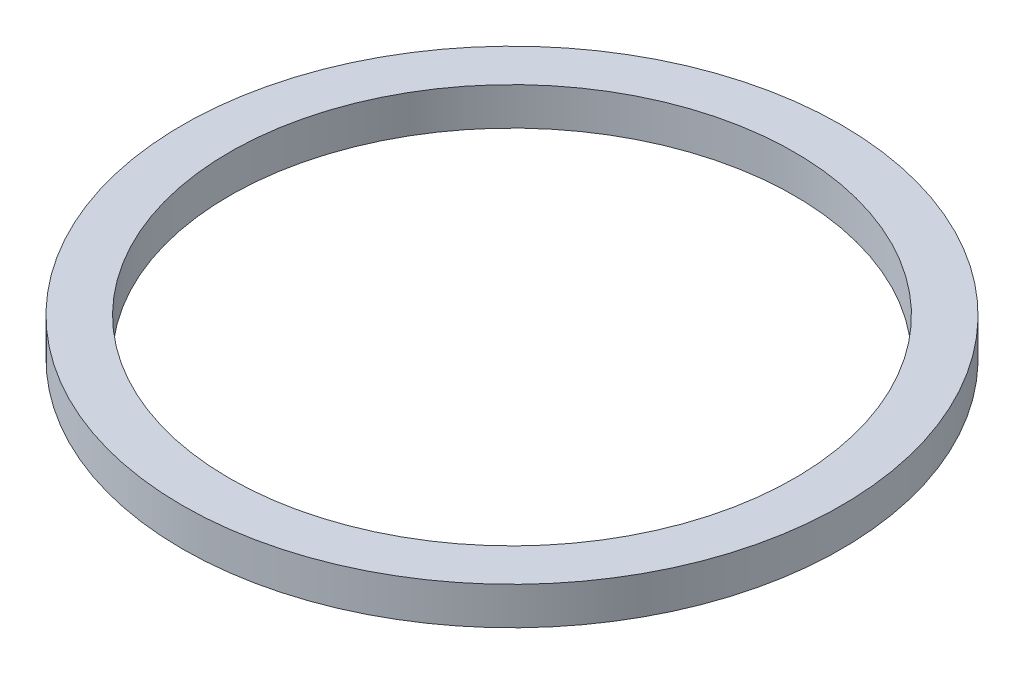
ISO-10303-21;
HEADER;
FILE_DESCRIPTION(('STEP AP214'),'2;1');
FILE_NAME('part.step','',(''),(''),'','','');
FILE_SCHEMA(('AUTOMOTIVE_DESIGN { 1 0 10303 214 1 1 1 1 }'));
ENDSEC;
DATA;
#1=APPLICATION_CONTEXT('core data for automotive mechanical design processes');
#2=APPLICATION_PROTOCOL_DEFINITION('international standard','automotive_design',2000,#1);
#3=PRODUCT_CONTEXT('',#1,'mechanical');
#4=PRODUCT('Part','Part','',(#3));
#5=PRODUCT_RELATED_PRODUCT_CATEGORY('part','',(#4));
#6=PRODUCT_DEFINITION_FORMATION('','',#4);
#7=PRODUCT_DEFINITION_CONTEXT('part definition',#1,'design');
#8=PRODUCT_DEFINITION('design','',#6,#7);
#9=PRODUCT_DEFINITION_SHAPE('','',#8);
#10=(LENGTH_UNIT() NAMED_UNIT(*) SI_UNIT(.MILLI.,.METRE.));
#11=(NAMED_UNIT(*) PLANE_ANGLE_UNIT() SI_UNIT($,.RADIAN.));
#12=(NAMED_UNIT(*) SI_UNIT($,.STERADIAN.) SOLID_ANGLE_UNIT());
#13=UNCERTAINTY_MEASURE_WITH_UNIT(LENGTH_MEASURE(1.E-05),#10,'distance_accuracy_value','');
#14=(GEOMETRIC_REPRESENTATION_CONTEXT(3) GLOBAL_UNCERTAINTY_ASSIGNED_CONTEXT((#13)) GLOBAL_UNIT_ASSIGNED_CONTEXT((#10,
#11,#12)) REPRESENTATION_CONTEXT('',''));
#15=CARTESIAN_POINT('',(0.,0.,0.));
#16=DIRECTION('',(0.,0.,1.));
#17=DIRECTION('',(1.,0.,0.));
#18=AXIS2_PLACEMENT_3D('',#15,#16,#17);
#19=CARTESIAN_POINT('',(0.,2.,0.));
#20=DIRECTION('',(0.,1.,0.));
#21=DIRECTION('',(0.,0.,1.));
#22=AXIS2_PLACEMENT_3D('',#19,#20,#21);
#23=PLANE('',#22);
#24=CARTESIAN_POINT('',(0.,2.,0.));
#25=DIRECTION('',(0.,1.,0.));
#26=DIRECTION('',(0.,0.,1.));
#27=AXIS2_PLACEMENT_3D('',#24,#25,#26);
#28=CIRCLE('',#27,17.5);
#29=CARTESIAN_POINT('',(0.,2.,17.5));
#30=VERTEX_POINT('',#29);
#31=EDGE_CURVE('E10',#30,#30,#28,.T.);
#32=ORIENTED_EDGE('',*,*,#31,.T.);
#33=EDGE_LOOP('',(#32));
#34=FACE_BOUND('',#33,.T.);
#35=CARTESIAN_POINT('',(0.,2.,0.));
#36=DIRECTION('',(0.,1.,0.));
#37=DIRECTION('',(0.,0.,1.));
#38=AXIS2_PLACEMENT_3D('',#35,#36,#37);
#39=CIRCLE('',#38,15.);
#40=CARTESIAN_POINT('',(0.,2.,15.));
#41=VERTEX_POINT('',#40);
#42=EDGE_CURVE('E54',#41,#41,#39,.T.);
#43=ORIENTED_EDGE('',*,*,#42,.F.);
#44=EDGE_LOOP('',(#43));
#45=FACE_BOUND('',#44,.T.);
#46=ADVANCED_FACE('F41',(#34,#45),#23,.T.);
#47=CARTESIAN_POINT('',(0.,0.,0.));
#48=DIRECTION('',(0.,1.,0.));
#49=DIRECTION('',(0.,0.,1.));
#50=AXIS2_PLACEMENT_3D('',#47,#48,#49);
#51=PLANE('',#50);
#52=CARTESIAN_POINT('',(0.,0.,0.));
#53=DIRECTION('',(0.,1.,0.));
#54=DIRECTION('',(0.,0.,1.));
#55=AXIS2_PLACEMENT_3D('',#52,#53,#54);
#56=CIRCLE('',#55,17.5);
#57=CARTESIAN_POINT('',(0.,0.,17.5));
#58=VERTEX_POINT('',#57);
#59=EDGE_CURVE('E45',#58,#58,#56,.T.);
#60=ORIENTED_EDGE('',*,*,#59,.F.);
#61=EDGE_LOOP('',(#60));
#62=FACE_BOUND('',#61,.T.);
#63=CARTESIAN_POINT('',(0.,0.,0.));
#64=DIRECTION('',(0.,1.,0.));
#65=DIRECTION('',(0.,0.,1.));
#66=AXIS2_PLACEMENT_3D('',#63,#64,#65);
#67=CIRCLE('',#66,15.);
#68=CARTESIAN_POINT('',(0.,0.,15.));
#69=VERTEX_POINT('',#68);
#70=EDGE_CURVE('E56',#69,#69,#67,.T.);
#71=ORIENTED_EDGE('',*,*,#70,.T.);
#72=EDGE_LOOP('',(#71));
#73=FACE_BOUND('',#72,.T.);
#74=ADVANCED_FACE('F68',(#62,#73),#51,.F.);
#75=CARTESIAN_POINT('',(0.,2.,0.));
#76=DIRECTION('',(0.,-1.,0.));
#77=DIRECTION('',(0.,0.,-1.));
#78=AXIS2_PLACEMENT_3D('',#75,#76,#77);
#79=CYLINDRICAL_SURFACE('',#78,17.5);
#80=ORIENTED_EDGE('',*,*,#31,.F.);
#81=EDGE_LOOP('',(#80));
#82=FACE_BOUND('',#81,.T.);
#83=ORIENTED_EDGE('',*,*,#59,.T.);
#84=EDGE_LOOP('',(#83));
#85=FACE_BOUND('',#84,.T.);
#86=ADVANCED_FACE('F43',(#82,#85),#79,.T.);
#87=CARTESIAN_POINT('',(0.,2.,0.));
#88=DIRECTION('',(0.,-1.,0.));
#89=DIRECTION('',(0.,0.,-1.));
#90=AXIS2_PLACEMENT_3D('',#87,#88,#89);
#91=CYLINDRICAL_SURFACE('',#90,15.);
#92=ORIENTED_EDGE('',*,*,#42,.T.);
#93=EDGE_LOOP('',(#92));
#94=FACE_BOUND('',#93,.T.);
#95=ORIENTED_EDGE('',*,*,#70,.F.);
#96=EDGE_LOOP('',(#95));
#97=FACE_BOUND('',#96,.T.);
#98=ADVANCED_FACE('F64',(#94,#97),#91,.F.);
#99=CLOSED_SHELL('',(#46,#74,#86,#98));
#100=MANIFOLD_SOLID_BREP('B2',#99);
#101=ADVANCED_BREP_SHAPE_REPRESENTATION('',(#18,#100),#14);
#102=SHAPE_DEFINITION_REPRESENTATION(#9,#101);
ENDSEC;
END-ISO-10303-21;
